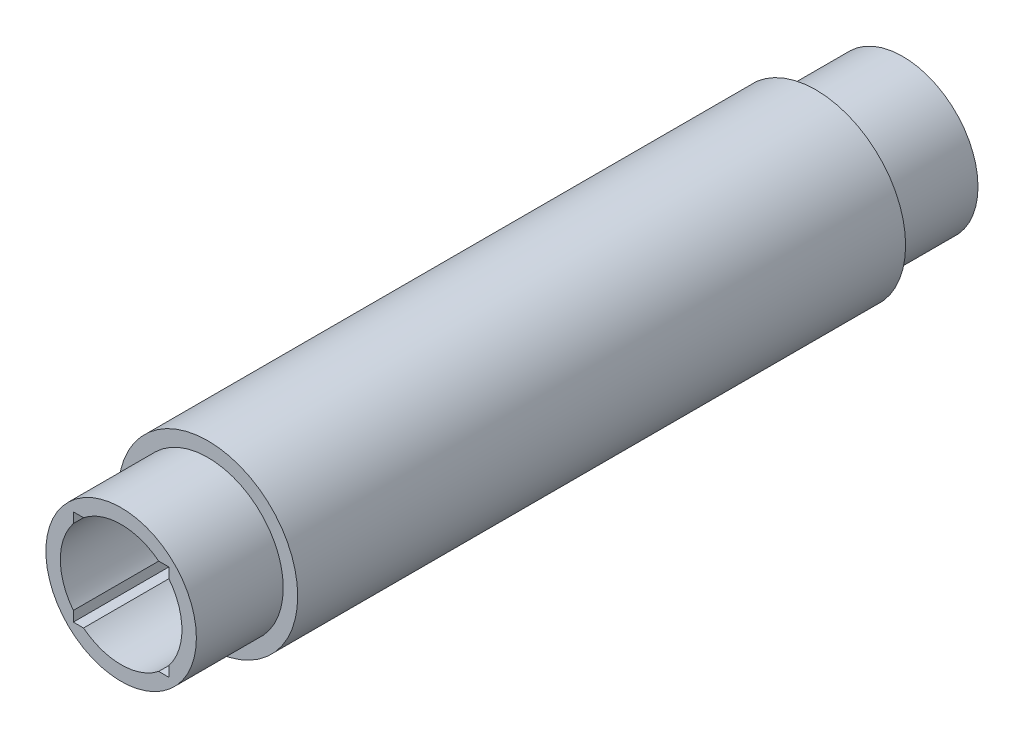
ISO-10303-21;
HEADER;
FILE_DESCRIPTION(('STEP AP214'),'2;1');
FILE_NAME('part.step','',(''),(''),'','','');
FILE_SCHEMA(('AUTOMOTIVE_DESIGN { 1 0 10303 214 1 1 1 1 }'));
ENDSEC;
DATA;
#1=APPLICATION_CONTEXT('core data for automotive mechanical design processes');
#2=APPLICATION_PROTOCOL_DEFINITION('international standard','automotive_design',2000,#1);
#3=PRODUCT_CONTEXT('',#1,'mechanical');
#4=PRODUCT('Part','Part','',(#3));
#5=PRODUCT_RELATED_PRODUCT_CATEGORY('part','',(#4));
#6=PRODUCT_DEFINITION_FORMATION('','',#4);
#7=PRODUCT_DEFINITION_CONTEXT('part definition',#1,'design');
#8=PRODUCT_DEFINITION('design','',#6,#7);
#9=PRODUCT_DEFINITION_SHAPE('','',#8);
#10=(LENGTH_UNIT() NAMED_UNIT(*) SI_UNIT(.MILLI.,.METRE.));
#11=(NAMED_UNIT(*) PLANE_ANGLE_UNIT() SI_UNIT($,.RADIAN.));
#12=(NAMED_UNIT(*) SI_UNIT($,.STERADIAN.) SOLID_ANGLE_UNIT());
#13=UNCERTAINTY_MEASURE_WITH_UNIT(LENGTH_MEASURE(1.E-05),#10,'distance_accuracy_value','');
#14=(GEOMETRIC_REPRESENTATION_CONTEXT(3) GLOBAL_UNCERTAINTY_ASSIGNED_CONTEXT((#13)) GLOBAL_UNIT_ASSIGNED_CONTEXT((#10,
#11,#12)) REPRESENTATION_CONTEXT('',''));
#15=CARTESIAN_POINT('',(0.,0.,0.));
#16=DIRECTION('',(0.,0.,1.));
#17=DIRECTION('',(1.,0.,0.));
#18=AXIS2_PLACEMENT_3D('',#15,#16,#17);
#19=CARTESIAN_POINT('',(0.,0.,27.));
#20=DIRECTION('',(0.,0.,-1.));
#21=DIRECTION('',(-1.,0.,0.));
#22=AXIS2_PLACEMENT_3D('',#19,#20,#21);
#23=CYLINDRICAL_SURFACE('',#22,4.2);
#24=DIRECTION('',(0.,0.,-1.));
#25=VECTOR('',#24,1.);
#26=CARTESIAN_POINT('',(-2.59807621135332,3.3,27.));
#27=LINE('',#26,#25);
#28=CARTESIAN_POINT('',(-2.59807621135332,3.3,12.));
#29=VERTEX_POINT('',#28);
#30=CARTESIAN_POINT('',(-2.59807621135332,3.3,27.));
#31=VERTEX_POINT('',#30);
#32=EDGE_CURVE('E346',#29,#31,#27,.F.);
#33=ORIENTED_EDGE('',*,*,#32,.F.);
#34=CARTESIAN_POINT('',(0.,0.,12.));
#35=DIRECTION('',(0.,0.,-1.));
#36=DIRECTION('',(-1.,0.,0.));
#37=AXIS2_PLACEMENT_3D('',#34,#35,#36);
#38=CIRCLE('',#37,4.2);
#39=CARTESIAN_POINT('',(-3.3,2.59807621135332,12.));
#40=VERTEX_POINT('',#39);
#41=EDGE_CURVE('E324',#40,#29,#38,.T.);
#42=ORIENTED_EDGE('',*,*,#41,.F.);
#43=DIRECTION('',(0.,0.,-1.));
#44=VECTOR('',#43,1.);
#45=CARTESIAN_POINT('',(-3.3,2.59807621135332,27.));
#46=LINE('',#45,#44);
#47=CARTESIAN_POINT('',(-3.3,2.59807621135332,27.));
#48=VERTEX_POINT('',#47);
#49=EDGE_CURVE('E343',#40,#48,#46,.F.);
#50=ORIENTED_EDGE('',*,*,#49,.T.);
#51=CARTESIAN_POINT('',(0.,0.,27.));
#52=DIRECTION('',(0.,0.,1.));
#53=DIRECTION('',(1.,0.,0.));
#54=AXIS2_PLACEMENT_3D('',#51,#52,#53);
#55=CIRCLE('',#54,4.2);
#56=CARTESIAN_POINT('',(-3.3,-2.59807621135332,27.));
#57=VERTEX_POINT('',#56);
#58=EDGE_CURVE('E710',#48,#57,#55,.T.);
#59=ORIENTED_EDGE('',*,*,#58,.T.);
#60=DIRECTION('',(0.,0.,-1.));
#61=VECTOR('',#60,1.);
#62=CARTESIAN_POINT('',(-3.3,-2.59807621135332,27.));
#63=LINE('',#62,#61);
#64=CARTESIAN_POINT('',(-3.3,-2.59807621135332,12.));
#65=VERTEX_POINT('',#64);
#66=EDGE_CURVE('E323',#57,#65,#63,.T.);
#67=ORIENTED_EDGE('',*,*,#66,.T.);
#68=CARTESIAN_POINT('',(-2.59807621135332,-3.3,12.));
#69=VERTEX_POINT('',#68);
#70=EDGE_CURVE('E321',#69,#65,#38,.T.);
#71=ORIENTED_EDGE('',*,*,#70,.F.);
#72=DIRECTION('',(0.,0.,-1.));
#73=VECTOR('',#72,1.);
#74=CARTESIAN_POINT('',(-2.59807621135332,-3.3,27.));
#75=LINE('',#74,#73);
#76=CARTESIAN_POINT('',(-2.59807621135332,-3.3,27.));
#77=VERTEX_POINT('',#76);
#78=EDGE_CURVE('E328',#69,#77,#75,.F.);
#79=ORIENTED_EDGE('',*,*,#78,.T.);
#80=CARTESIAN_POINT('',(2.59807621135332,-3.3,27.));
#81=VERTEX_POINT('',#80);
#82=EDGE_CURVE('E306',#77,#81,#55,.T.);
#83=ORIENTED_EDGE('',*,*,#82,.T.);
#84=DIRECTION('',(0.,0.,-1.));
#85=VECTOR('',#84,1.);
#86=CARTESIAN_POINT('',(2.59807621135332,-3.3,27.));
#87=LINE('',#86,#85);
#88=CARTESIAN_POINT('',(2.59807621135332,-3.3,12.));
#89=VERTEX_POINT('',#88);
#90=EDGE_CURVE('E331',#81,#89,#87,.T.);
#91=ORIENTED_EDGE('',*,*,#90,.T.);
#92=CARTESIAN_POINT('',(3.3,-2.59807621135332,12.));
#93=VERTEX_POINT('',#92);
#94=EDGE_CURVE('E325',#93,#89,#38,.T.);
#95=ORIENTED_EDGE('',*,*,#94,.F.);
#96=DIRECTION('',(0.,0.,-1.));
#97=VECTOR('',#96,1.);
#98=CARTESIAN_POINT('',(3.3,-2.59807621135332,27.));
#99=LINE('',#98,#97);
#100=CARTESIAN_POINT('',(3.3,-2.59807621135332,27.));
#101=VERTEX_POINT('',#100);
#102=EDGE_CURVE('E334',#101,#93,#99,.T.);
#103=ORIENTED_EDGE('',*,*,#102,.F.);
#104=CARTESIAN_POINT('',(3.3,2.59807621135332,27.));
#105=VERTEX_POINT('',#104);
#106=EDGE_CURVE('E303',#101,#105,#55,.T.);
#107=ORIENTED_EDGE('',*,*,#106,.T.);
#108=DIRECTION('',(0.,0.,-1.));
#109=VECTOR('',#108,1.);
#110=CARTESIAN_POINT('',(3.3,2.59807621135332,27.));
#111=LINE('',#110,#109);
#112=CARTESIAN_POINT('',(3.3,2.59807621135332,12.));
#113=VERTEX_POINT('',#112);
#114=EDGE_CURVE('E338',#113,#105,#111,.F.);
#115=ORIENTED_EDGE('',*,*,#114,.F.);
#116=CARTESIAN_POINT('',(2.59807621135332,3.3,12.));
#117=VERTEX_POINT('',#116);
#118=EDGE_CURVE('E337',#117,#113,#38,.T.);
#119=ORIENTED_EDGE('',*,*,#118,.F.);
#120=DIRECTION('',(0.,0.,-1.));
#121=VECTOR('',#120,1.);
#122=CARTESIAN_POINT('',(2.59807621135332,3.3,27.));
#123=LINE('',#122,#121);
#124=CARTESIAN_POINT('',(2.59807621135332,3.3,27.));
#125=VERTEX_POINT('',#124);
#126=EDGE_CURVE('E340',#125,#117,#123,.T.);
#127=ORIENTED_EDGE('',*,*,#126,.F.);
#128=EDGE_CURVE('E308',#125,#31,#55,.T.);
#129=ORIENTED_EDGE('',*,*,#128,.T.);
#130=EDGE_LOOP('',(#33,#42,#50,#59,#67,#71,#79,#83,#91,#95,#103,#107,#115,#119,#127,#129));
#131=FACE_BOUND('',#130,.T.);
#132=CARTESIAN_POINT('',(0.,0.,-12.));
#133=DIRECTION('',(0.,0.,1.));
#134=DIRECTION('',(1.,0.,0.));
#135=AXIS2_PLACEMENT_3D('',#132,#133,#134);
#136=CIRCLE('',#135,4.2);
#137=CARTESIAN_POINT('',(3.3,2.59807621135332,-12.));
#138=VERTEX_POINT('',#137);
#139=CARTESIAN_POINT('',(2.59807621135332,3.3,-12.));
#140=VERTEX_POINT('',#139);
#141=EDGE_CURVE('E12',#138,#140,#136,.T.);
#142=ORIENTED_EDGE('',*,*,#141,.F.);
#143=DIRECTION('',(0.,0.,-1.));
#144=VECTOR('',#143,1.);
#145=CARTESIAN_POINT('',(3.3,2.59807621135332,27.));
#146=LINE('',#145,#144);
#147=CARTESIAN_POINT('',(3.3,2.59807621135332,-27.));
#148=VERTEX_POINT('',#147);
#149=EDGE_CURVE('E213',#138,#148,#146,.T.);
#150=ORIENTED_EDGE('',*,*,#149,.T.);
#151=CARTESIAN_POINT('',(0.,0.,-27.));
#152=DIRECTION('',(0.,0.,1.));
#153=DIRECTION('',(1.,0.,0.));
#154=AXIS2_PLACEMENT_3D('',#151,#152,#153);
#155=CIRCLE('',#154,4.2);
#156=CARTESIAN_POINT('',(3.3,-2.59807621135332,-27.));
#157=VERTEX_POINT('',#156);
#158=EDGE_CURVE('E300',#157,#148,#155,.T.);
#159=ORIENTED_EDGE('',*,*,#158,.F.);
#160=DIRECTION('',(0.,0.,-1.));
#161=VECTOR('',#160,1.);
#162=CARTESIAN_POINT('',(3.3,-2.59807621135332,27.));
#163=LINE('',#162,#161);
#164=CARTESIAN_POINT('',(3.3,-2.59807621135332,-12.));
#165=VERTEX_POINT('',#164);
#166=EDGE_CURVE('E251',#157,#165,#163,.F.);
#167=ORIENTED_EDGE('',*,*,#166,.T.);
#168=CARTESIAN_POINT('',(2.59807621135332,-3.3,-12.));
#169=VERTEX_POINT('',#168);
#170=EDGE_CURVE('E46',#169,#165,#136,.T.);
#171=ORIENTED_EDGE('',*,*,#170,.F.);
#172=DIRECTION('',(0.,0.,-1.));
#173=VECTOR('',#172,1.);
#174=CARTESIAN_POINT('',(2.59807621135332,-3.3,27.));
#175=LINE('',#174,#173);
#176=CARTESIAN_POINT('',(2.59807621135332,-3.3,-27.));
#177=VERTEX_POINT('',#176);
#178=EDGE_CURVE('E232',#169,#177,#175,.T.);
#179=ORIENTED_EDGE('',*,*,#178,.T.);
#180=CARTESIAN_POINT('',(-2.59807621135332,-3.3,-27.));
#181=VERTEX_POINT('',#180);
#182=EDGE_CURVE('E311',#181,#177,#155,.T.);
#183=ORIENTED_EDGE('',*,*,#182,.F.);
#184=DIRECTION('',(0.,0.,-1.));
#185=VECTOR('',#184,1.);
#186=CARTESIAN_POINT('',(-2.59807621135332,-3.3,27.));
#187=LINE('',#186,#185);
#188=CARTESIAN_POINT('',(-2.59807621135332,-3.3,-12.));
#189=VERTEX_POINT('',#188);
#190=EDGE_CURVE('E66',#181,#189,#187,.F.);
#191=ORIENTED_EDGE('',*,*,#190,.T.);
#192=CARTESIAN_POINT('',(-3.3,-2.59807621135332,-12.));
#193=VERTEX_POINT('',#192);
#194=EDGE_CURVE('E499',#193,#189,#136,.T.);
#195=ORIENTED_EDGE('',*,*,#194,.F.);
#196=DIRECTION('',(0.,0.,-1.));
#197=VECTOR('',#196,1.);
#198=CARTESIAN_POINT('',(-3.3,-2.59807621135332,27.));
#199=LINE('',#198,#197);
#200=CARTESIAN_POINT('',(-3.3,-2.59807621135332,-27.));
#201=VERTEX_POINT('',#200);
#202=EDGE_CURVE('E243',#193,#201,#199,.T.);
#203=ORIENTED_EDGE('',*,*,#202,.T.);
#204=CARTESIAN_POINT('',(-3.3,2.59807621135332,-27.));
#205=VERTEX_POINT('',#204);
#206=EDGE_CURVE('E367',#205,#201,#155,.T.);
#207=ORIENTED_EDGE('',*,*,#206,.F.);
#208=DIRECTION('',(0.,0.,-1.));
#209=VECTOR('',#208,1.);
#210=CARTESIAN_POINT('',(-3.3,2.59807621135332,27.));
#211=LINE('',#210,#209);
#212=CARTESIAN_POINT('',(-3.3,2.59807621135332,-12.));
#213=VERTEX_POINT('',#212);
#214=EDGE_CURVE('E240',#205,#213,#211,.F.);
#215=ORIENTED_EDGE('',*,*,#214,.T.);
#216=CARTESIAN_POINT('',(-2.59807621135332,3.3,-12.));
#217=VERTEX_POINT('',#216);
#218=EDGE_CURVE('E51',#217,#213,#136,.T.);
#219=ORIENTED_EDGE('',*,*,#218,.F.);
#220=DIRECTION('',(0.,0.,-1.));
#221=VECTOR('',#220,1.);
#222=CARTESIAN_POINT('',(-2.59807621135332,3.3,27.));
#223=LINE('',#222,#221);
#224=CARTESIAN_POINT('',(-2.59807621135332,3.3,-27.));
#225=VERTEX_POINT('',#224);
#226=EDGE_CURVE('E248',#217,#225,#223,.T.);
#227=ORIENTED_EDGE('',*,*,#226,.T.);
#228=CARTESIAN_POINT('',(2.59807621135332,3.3,-27.));
#229=VERTEX_POINT('',#228);
#230=EDGE_CURVE('E307',#229,#225,#155,.T.);
#231=ORIENTED_EDGE('',*,*,#230,.F.);
#232=DIRECTION('',(0.,0.,-1.));
#233=VECTOR('',#232,1.);
#234=CARTESIAN_POINT('',(2.59807621135332,3.3,27.));
#235=LINE('',#234,#233);
#236=EDGE_CURVE('E246',#229,#140,#235,.F.);
#237=ORIENTED_EDGE('',*,*,#236,.T.);
#238=EDGE_LOOP('',(#142,#150,#159,#167,#171,#179,#183,#191,#195,#203,#207,#215,#219,#227,#231,#237));
#239=FACE_BOUND('',#238,.T.);
#240=ADVANCED_FACE('F42',(#131,#239),#23,.F.);
#241=CARTESIAN_POINT('',(0.,0.,-27.));
#242=DIRECTION('',(0.,0.,1.));
#243=DIRECTION('',(1.,0.,0.));
#244=AXIS2_PLACEMENT_3D('',#241,#242,#243);
#245=PLANE('',#244);
#246=CARTESIAN_POINT('',(0.,0.,-27.));
#247=DIRECTION('',(0.,0.,1.));
#248=DIRECTION('',(1.,0.,0.));
#249=AXIS2_PLACEMENT_3D('',#246,#247,#248);
#250=CIRCLE('',#249,5.2);
#251=CARTESIAN_POINT('',(5.2,0.,-27.));
#252=VERTEX_POINT('',#251);
#253=EDGE_CURVE('E316',#252,#252,#250,.T.);
#254=ORIENTED_EDGE('',*,*,#253,.F.);
#255=EDGE_LOOP('',(#254));
#256=FACE_BOUND('',#255,.T.);
#257=DIRECTION('',(0.,-1.,0.));
#258=VECTOR('',#257,1.);
#259=CARTESIAN_POINT('',(3.3,0.,-27.));
#260=LINE('',#259,#258);
#261=CARTESIAN_POINT('',(3.3,3.3,-27.));
#262=VERTEX_POINT('',#261);
#263=EDGE_CURVE('E353',#262,#148,#260,.T.);
#264=ORIENTED_EDGE('',*,*,#263,.F.);
#265=DIRECTION('',(-1.,0.,0.));
#266=VECTOR('',#265,1.);
#267=CARTESIAN_POINT('',(0.,3.3,-27.));
#268=LINE('',#267,#266);
#269=EDGE_CURVE('E229',#262,#229,#268,.T.);
#270=ORIENTED_EDGE('',*,*,#269,.T.);
#271=ORIENTED_EDGE('',*,*,#230,.T.);
#272=DIRECTION('',(1.,0.,0.));
#273=VECTOR('',#272,1.);
#274=CARTESIAN_POINT('',(0.,3.3,-27.));
#275=LINE('',#274,#273);
#276=CARTESIAN_POINT('',(-3.3,3.3,-27.));
#277=VERTEX_POINT('',#276);
#278=EDGE_CURVE('E351',#277,#225,#275,.T.);
#279=ORIENTED_EDGE('',*,*,#278,.F.);
#280=DIRECTION('',(0.,-1.,0.));
#281=VECTOR('',#280,1.);
#282=CARTESIAN_POINT('',(-3.3,0.,-27.));
#283=LINE('',#282,#281);
#284=EDGE_CURVE('E393',#277,#205,#283,.T.);
#285=ORIENTED_EDGE('',*,*,#284,.T.);
#286=ORIENTED_EDGE('',*,*,#206,.T.);
#287=DIRECTION('',(0.,1.,0.));
#288=VECTOR('',#287,1.);
#289=CARTESIAN_POINT('',(-3.3,0.,-27.));
#290=LINE('',#289,#288);
#291=CARTESIAN_POINT('',(-3.3,-3.3,-27.));
#292=VERTEX_POINT('',#291);
#293=EDGE_CURVE('E348',#292,#201,#290,.T.);
#294=ORIENTED_EDGE('',*,*,#293,.F.);
#295=DIRECTION('',(1.,0.,0.));
#296=VECTOR('',#295,1.);
#297=CARTESIAN_POINT('',(0.,-3.3,-27.));
#298=LINE('',#297,#296);
#299=EDGE_CURVE('E217',#292,#181,#298,.T.);
#300=ORIENTED_EDGE('',*,*,#299,.T.);
#301=ORIENTED_EDGE('',*,*,#182,.T.);
#302=DIRECTION('',(-1.,0.,0.));
#303=VECTOR('',#302,1.);
#304=CARTESIAN_POINT('',(0.,-3.3,-27.));
#305=LINE('',#304,#303);
#306=CARTESIAN_POINT('',(3.3,-3.3,-27.));
#307=VERTEX_POINT('',#306);
#308=EDGE_CURVE('E349',#307,#177,#305,.T.);
#309=ORIENTED_EDGE('',*,*,#308,.F.);
#310=DIRECTION('',(0.,1.,0.));
#311=VECTOR('',#310,1.);
#312=CARTESIAN_POINT('',(3.3,0.,-27.));
#313=LINE('',#312,#311);
#314=EDGE_CURVE('E58',#307,#157,#313,.T.);
#315=ORIENTED_EDGE('',*,*,#314,.T.);
#316=ORIENTED_EDGE('',*,*,#158,.T.);
#317=EDGE_LOOP('',(#264,#270,#271,#279,#285,#286,#294,#300,#301,#309,#315,#316));
#318=FACE_BOUND('',#317,.T.);
#319=ADVANCED_FACE('F366',(#256,#318),#245,.F.);
#320=CARTESIAN_POINT('',(0.,0.,27.));
#321=DIRECTION('',(0.,0.,1.));
#322=DIRECTION('',(1.,0.,0.));
#323=AXIS2_PLACEMENT_3D('',#320,#321,#322);
#324=PLANE('',#323);
#325=DIRECTION('',(-1.,0.,0.));
#326=VECTOR('',#325,1.);
#327=CARTESIAN_POINT('',(0.,3.3,27.));
#328=LINE('',#327,#326);
#329=CARTESIAN_POINT('',(3.3,3.3,27.));
#330=VERTEX_POINT('',#329);
#331=EDGE_CURVE('E271',#330,#125,#328,.T.);
#332=ORIENTED_EDGE('',*,*,#331,.F.);
#333=DIRECTION('',(0.,1.,0.));
#334=VECTOR('',#333,1.);
#335=CARTESIAN_POINT('',(3.3,0.,27.));
#336=LINE('',#335,#334);
#337=EDGE_CURVE('E281',#105,#330,#336,.T.);
#338=ORIENTED_EDGE('',*,*,#337,.F.);
#339=ORIENTED_EDGE('',*,*,#106,.F.);
#340=CARTESIAN_POINT('',(3.3,-3.3,27.));
#341=VERTEX_POINT('',#340);
#342=EDGE_CURVE('E282',#341,#101,#336,.T.);
#343=ORIENTED_EDGE('',*,*,#342,.F.);
#344=DIRECTION('',(-1.,0.,0.));
#345=VECTOR('',#344,1.);
#346=CARTESIAN_POINT('',(0.,-3.3,27.));
#347=LINE('',#346,#345);
#348=EDGE_CURVE('E278',#341,#81,#347,.T.);
#349=ORIENTED_EDGE('',*,*,#348,.T.);
#350=ORIENTED_EDGE('',*,*,#82,.F.);
#351=CARTESIAN_POINT('',(-3.3,-3.3,27.));
#352=VERTEX_POINT('',#351);
#353=EDGE_CURVE('E277',#77,#352,#347,.T.);
#354=ORIENTED_EDGE('',*,*,#353,.T.);
#355=DIRECTION('',(0.,1.,0.));
#356=VECTOR('',#355,1.);
#357=CARTESIAN_POINT('',(-3.3,0.,27.));
#358=LINE('',#357,#356);
#359=EDGE_CURVE('E274',#352,#57,#358,.T.);
#360=ORIENTED_EDGE('',*,*,#359,.T.);
#361=ORIENTED_EDGE('',*,*,#58,.F.);
#362=CARTESIAN_POINT('',(-3.3,3.3,27.));
#363=VERTEX_POINT('',#362);
#364=EDGE_CURVE('E273',#48,#363,#358,.T.);
#365=ORIENTED_EDGE('',*,*,#364,.T.);
#366=EDGE_CURVE('E255',#31,#363,#328,.T.);
#367=ORIENTED_EDGE('',*,*,#366,.F.);
#368=ORIENTED_EDGE('',*,*,#128,.F.);
#369=EDGE_LOOP('',(#332,#338,#339,#343,#349,#350,#354,#360,#361,#365,#367,#368));
#370=FACE_BOUND('',#369,.T.);
#371=CARTESIAN_POINT('',(0.,0.,27.));
#372=DIRECTION('',(0.,0.,1.));
#373=DIRECTION('',(1.,0.,0.));
#374=AXIS2_PLACEMENT_3D('',#371,#372,#373);
#375=CIRCLE('',#374,5.2);
#376=CARTESIAN_POINT('',(5.2,0.,27.));
#377=VERTEX_POINT('',#376);
#378=EDGE_CURVE('E312',#377,#377,#375,.T.);
#379=ORIENTED_EDGE('',*,*,#378,.T.);
#380=EDGE_LOOP('',(#379));
#381=FACE_BOUND('',#380,.T.);
#382=ADVANCED_FACE('F425',(#370,#381),#324,.T.);
#383=CARTESIAN_POINT('',(0.,0.,27.));
#384=DIRECTION('',(0.,0.,-1.));
#385=DIRECTION('',(-1.,0.,0.));
#386=AXIS2_PLACEMENT_3D('',#383,#384,#385);
#387=CYLINDRICAL_SURFACE('',#386,5.2);
#388=ORIENTED_EDGE('',*,*,#253,.T.);
#389=EDGE_LOOP('',(#388));
#390=FACE_BOUND('',#389,.T.);
#391=CARTESIAN_POINT('',(0.,0.,-21.));
#392=DIRECTION('',(0.,0.,1.));
#393=DIRECTION('',(1.,0.,0.));
#394=AXIS2_PLACEMENT_3D('',#391,#392,#393);
#395=CIRCLE('',#394,5.2);
#396=CARTESIAN_POINT('',(5.2,0.,-21.));
#397=VERTEX_POINT('',#396);
#398=EDGE_CURVE('E315',#397,#397,#395,.T.);
#399=ORIENTED_EDGE('',*,*,#398,.F.);
#400=EDGE_LOOP('',(#399));
#401=FACE_BOUND('',#400,.T.);
#402=ADVANCED_FACE('F433',(#390,#401),#387,.T.);
#403=CARTESIAN_POINT('',(0.,0.,21.));
#404=DIRECTION('',(0.,0.,1.));
#405=DIRECTION('',(1.,0.,0.));
#406=AXIS2_PLACEMENT_3D('',#403,#404,#405);
#407=CIRCLE('',#406,5.2);
#408=CARTESIAN_POINT('',(5.2,0.,21.));
#409=VERTEX_POINT('',#408);
#410=EDGE_CURVE('E294',#409,#409,#407,.T.);
#411=ORIENTED_EDGE('',*,*,#410,.T.);
#412=EDGE_LOOP('',(#411));
#413=FACE_BOUND('',#412,.T.);
#414=ORIENTED_EDGE('',*,*,#378,.F.);
#415=EDGE_LOOP('',(#414));
#416=FACE_BOUND('',#415,.T.);
#417=ADVANCED_FACE('F44',(#413,#416),#387,.T.);
#418=CARTESIAN_POINT('',(0.,0.,21.));
#419=DIRECTION('',(0.,0.,-1.));
#420=DIRECTION('',(-1.,0.,0.));
#421=AXIS2_PLACEMENT_3D('',#418,#419,#420);
#422=CYLINDRICAL_SURFACE('',#421,6.2);
#423=CARTESIAN_POINT('',(0.,0.,21.));
#424=DIRECTION('',(0.,0.,1.));
#425=DIRECTION('',(1.,0.,0.));
#426=AXIS2_PLACEMENT_3D('',#423,#424,#425);
#427=CIRCLE('',#426,6.2);
#428=CARTESIAN_POINT('',(-6.2,0.,21.));
#429=VERTEX_POINT('',#428);
#430=EDGE_CURVE('E297',#429,#429,#427,.T.);
#431=CARTESIAN_POINT('',(0.,0.,-21.));
#432=DIRECTION('',(0.,0.,1.));
#433=DIRECTION('',(1.,0.,0.));
#434=AXIS2_PLACEMENT_3D('',#431,#432,#433);
#435=CIRCLE('',#434,6.2);
#436=CARTESIAN_POINT('',(-6.2,0.,-21.));
#437=VERTEX_POINT('',#436);
#438=EDGE_CURVE('E287',#437,#437,#435,.T.);
#439=CARTESIAN_POINT('',(-6.2,0.,21.));
#440=CARTESIAN_POINT('',(-6.2,0.,20.5625));
#441=CARTESIAN_POINT('',(-6.2,0.,20.125));
#442=CARTESIAN_POINT('',(-6.2,0.,19.25));
#443=CARTESIAN_POINT('',(-6.2,0.,18.8125));
#444=CARTESIAN_POINT('',(-6.2,0.,17.9375));
#445=CARTESIAN_POINT('',(-6.2,0.,17.5));
#446=CARTESIAN_POINT('',(-6.2,0.,16.625));
#447=CARTESIAN_POINT('',(-6.2,0.,16.1875));
#448=CARTESIAN_POINT('',(-6.2,0.,15.3125));
#449=CARTESIAN_POINT('',(-6.2,0.,14.875));
#450=CARTESIAN_POINT('',(-6.2,0.,14.));
#451=CARTESIAN_POINT('',(-6.2,0.,13.5625));
#452=CARTESIAN_POINT('',(-6.2,0.,12.6875));
#453=CARTESIAN_POINT('',(-6.2,0.,12.25));
#454=CARTESIAN_POINT('',(-6.2,0.,11.375));
#455=CARTESIAN_POINT('',(-6.2,0.,10.9375));
#456=CARTESIAN_POINT('',(-6.2,0.,10.0625));
#457=CARTESIAN_POINT('',(-6.2,0.,9.625));
#458=CARTESIAN_POINT('',(-6.2,0.,8.75));
#459=CARTESIAN_POINT('',(-6.2,0.,8.3125));
#460=CARTESIAN_POINT('',(-6.2,0.,7.4375));
#461=CARTESIAN_POINT('',(-6.2,0.,7.));
#462=CARTESIAN_POINT('',(-6.2,0.,6.125));
#463=CARTESIAN_POINT('',(-6.2,0.,5.6875));
#464=CARTESIAN_POINT('',(-6.2,0.,4.8125));
#465=CARTESIAN_POINT('',(-6.2,0.,4.375));
#466=CARTESIAN_POINT('',(-6.2,0.,3.5));
#467=CARTESIAN_POINT('',(-6.2,0.,3.0625));
#468=CARTESIAN_POINT('',(-6.2,0.,2.1875));
#469=CARTESIAN_POINT('',(-6.2,0.,1.75));
#470=CARTESIAN_POINT('',(-6.2,0.,0.874999999999997));
#471=CARTESIAN_POINT('',(-6.2,0.,0.437499999999997));
#472=CARTESIAN_POINT('',(-6.2,0.,-0.437500000000004));
#473=CARTESIAN_POINT('',(-6.2,0.,-0.875000000000004));
#474=CARTESIAN_POINT('',(-6.2,0.,-1.75000000000001));
#475=CARTESIAN_POINT('',(-6.2,0.,-2.18750000000001));
#476=CARTESIAN_POINT('',(-6.2,0.,-3.0625));
#477=CARTESIAN_POINT('',(-6.2,0.,-3.5));
#478=CARTESIAN_POINT('',(-6.2,0.,-4.375));
#479=CARTESIAN_POINT('',(-6.2,0.,-4.8125));
#480=CARTESIAN_POINT('',(-6.2,0.,-5.68750000000001));
#481=CARTESIAN_POINT('',(-6.2,0.,-6.12500000000001));
#482=CARTESIAN_POINT('',(-6.2,0.,-7.00000000000001));
#483=CARTESIAN_POINT('',(-6.2,0.,-7.4375));
#484=CARTESIAN_POINT('',(-6.2,0.,-8.3125));
#485=CARTESIAN_POINT('',(-6.2,0.,-8.75));
#486=CARTESIAN_POINT('',(-6.2,0.,-9.625));
#487=CARTESIAN_POINT('',(-6.2,0.,-10.0625));
#488=CARTESIAN_POINT('',(-6.2,0.,-10.9375));
#489=CARTESIAN_POINT('',(-6.2,0.,-11.375));
#490=CARTESIAN_POINT('',(-6.2,0.,-12.25));
#491=CARTESIAN_POINT('',(-6.2,0.,-12.6875));
#492=CARTESIAN_POINT('',(-6.2,0.,-13.5625));
#493=CARTESIAN_POINT('',(-6.2,0.,-14.));
#494=CARTESIAN_POINT('',(-6.2,0.,-14.875));
#495=CARTESIAN_POINT('',(-6.2,0.,-15.3125));
#496=CARTESIAN_POINT('',(-6.2,0.,-16.1875));
#497=CARTESIAN_POINT('',(-6.2,0.,-16.625));
#498=CARTESIAN_POINT('',(-6.2,0.,-17.5));
#499=CARTESIAN_POINT('',(-6.2,0.,-17.9375));
#500=CARTESIAN_POINT('',(-6.2,0.,-18.8125));
#501=CARTESIAN_POINT('',(-6.2,0.,-19.25));
#502=CARTESIAN_POINT('',(-6.2,0.,-20.125));
#503=CARTESIAN_POINT('',(-6.2,0.,-20.5625));
#504=CARTESIAN_POINT('',(-6.2,0.,-21.));
#505=B_SPLINE_CURVE_WITH_KNOTS('',3,(#439,#440,#441,#442,#443,#444,#445,#446,#447,#448,#449,
#450,#451,#452,#453,#454,#455,#456,#457,#458,#459,#460,#461,#462,#463,#464,#465,#466,#467,#468,
#469,#470,#471,#472,#473,#474,#475,#476,#477,#478,#479,#480,#481,#482,#483,#484,#485,#486,#487,
#488,#489,#490,#491,#492,#493,#494,#495,#496,#497,#498,#499,#500,#501,#502,#503,#504),
.UNSPECIFIED.,.F.,.F.,(4,2,2,2,2,2,2,2,2,2,2,2,2,2,2,2,2,2,2,2,2,2,2,2,2,2,2,2,2,2,2,2,4),(0.,
1.3125,2.625,3.9375,5.25,6.5625,7.875,9.1875,10.5,11.8125,13.125,14.4375,15.75,17.0625,18.375,
19.6875,21.,22.3125,23.625,24.9375,26.25,27.5625,28.875,30.1875,31.5,32.8125,34.125,35.4375,
36.75,38.0625,39.375,40.6875,42.),.UNSPECIFIED.);
#506=EDGE_CURVE('BSEAM430',#429,#437,#505,.T.);
#507=ORIENTED_EDGE('',*,*,#430,.F.);
#508=ORIENTED_EDGE('',*,*,#438,.T.);
#509=ORIENTED_EDGE('',*,*,#506,.T.);
#510=ORIENTED_EDGE('',*,*,#506,.F.);
#511=EDGE_LOOP('',(#507,#509,#508,#510));
#512=FACE_BOUND('',#511,.T.);
#513=ADVANCED_FACE('F430',(#512),#422,.T.);
#514=CARTESIAN_POINT('',(0.,0.,21.));
#515=DIRECTION('',(0.,0.,1.));
#516=DIRECTION('',(1.,0.,0.));
#517=AXIS2_PLACEMENT_3D('',#514,#515,#516);
#518=PLANE('',#517);
#519=ORIENTED_EDGE('',*,*,#410,.F.);
#520=EDGE_LOOP('',(#519));
#521=FACE_BOUND('',#520,.T.);
#522=ORIENTED_EDGE('',*,*,#430,.T.);
#523=EDGE_LOOP('',(#522));
#524=FACE_BOUND('',#523,.T.);
#525=ADVANCED_FACE('F450',(#521,#524),#518,.T.);
#526=CARTESIAN_POINT('',(0.,0.,-21.));
#527=DIRECTION('',(0.,0.,1.));
#528=DIRECTION('',(1.,0.,0.));
#529=AXIS2_PLACEMENT_3D('',#526,#527,#528);
#530=PLANE('',#529);
#531=ORIENTED_EDGE('',*,*,#398,.T.);
#532=EDGE_LOOP('',(#531));
#533=FACE_BOUND('',#532,.T.);
#534=ORIENTED_EDGE('',*,*,#438,.F.);
#535=EDGE_LOOP('',(#534));
#536=FACE_BOUND('',#535,.T.);
#537=ADVANCED_FACE('F456',(#533,#536),#530,.F.);
#538=CARTESIAN_POINT('',(0.,0.,12.));
#539=DIRECTION('',(0.,0.,-1.));
#540=DIRECTION('',(-1.,0.,0.));
#541=AXIS2_PLACEMENT_3D('',#538,#539,#540);
#542=PLANE('',#541);
#543=ORIENTED_EDGE('',*,*,#70,.T.);
#544=DIRECTION('',(0.,1.,0.));
#545=VECTOR('',#544,1.);
#546=CARTESIAN_POINT('',(-3.3,0.,12.));
#547=LINE('',#546,#545);
#548=CARTESIAN_POINT('',(-3.3,-3.3,12.));
#549=VERTEX_POINT('',#548);
#550=EDGE_CURVE('E260',#549,#65,#547,.T.);
#551=ORIENTED_EDGE('',*,*,#550,.F.);
#552=DIRECTION('',(-1.,0.,0.));
#553=VECTOR('',#552,1.);
#554=CARTESIAN_POINT('',(0.,-3.3,12.));
#555=LINE('',#554,#553);
#556=EDGE_CURVE('E263',#69,#549,#555,.T.);
#557=ORIENTED_EDGE('',*,*,#556,.F.);
#558=EDGE_LOOP('',(#543,#551,#557));
#559=FACE_BOUND('',#558,.T.);
#560=ADVANCED_FACE('F463',(#559),#542,.F.);
#561=CARTESIAN_POINT('',(-3.3,0.,12.));
#562=DIRECTION('',(1.,0.,0.));
#563=DIRECTION('',(0.,1.,0.));
#564=AXIS2_PLACEMENT_3D('',#561,#562,#563);
#565=PLANE('',#564);
#566=ORIENTED_EDGE('',*,*,#359,.F.);
#567=DIRECTION('',(0.,0.,1.));
#568=VECTOR('',#567,1.);
#569=CARTESIAN_POINT('',(-3.3,-3.3,12.));
#570=LINE('',#569,#568);
#571=EDGE_CURVE('E290',#549,#352,#570,.T.);
#572=ORIENTED_EDGE('',*,*,#571,.F.);
#573=ORIENTED_EDGE('',*,*,#550,.T.);
#574=ORIENTED_EDGE('',*,*,#66,.F.);
#575=EDGE_LOOP('',(#566,#572,#573,#574));
#576=FACE_BOUND('',#575,.T.);
#577=ADVANCED_FACE('F415',(#576),#565,.T.);
#578=CARTESIAN_POINT('',(0.,-3.3,12.));
#579=DIRECTION('',(0.,1.,0.));
#580=DIRECTION('',(0.,0.,1.));
#581=AXIS2_PLACEMENT_3D('',#578,#579,#580);
#582=PLANE('',#581);
#583=ORIENTED_EDGE('',*,*,#556,.T.);
#584=ORIENTED_EDGE('',*,*,#571,.T.);
#585=ORIENTED_EDGE('',*,*,#353,.F.);
#586=ORIENTED_EDGE('',*,*,#78,.F.);
#587=EDGE_LOOP('',(#583,#584,#585,#586));
#588=FACE_BOUND('',#587,.T.);
#589=ADVANCED_FACE('F477',(#588),#582,.T.);
#590=ORIENTED_EDGE('',*,*,#94,.T.);
#591=CARTESIAN_POINT('',(3.3,-3.3,12.));
#592=VERTEX_POINT('',#591);
#593=EDGE_CURVE('E264',#592,#89,#555,.T.);
#594=ORIENTED_EDGE('',*,*,#593,.F.);
#595=DIRECTION('',(0.,1.,0.));
#596=VECTOR('',#595,1.);
#597=CARTESIAN_POINT('',(3.3,0.,12.));
#598=LINE('',#597,#596);
#599=EDGE_CURVE('E268',#592,#93,#598,.T.);
#600=ORIENTED_EDGE('',*,*,#599,.T.);
#601=EDGE_LOOP('',(#590,#594,#600));
#602=FACE_BOUND('',#601,.T.);
#603=ADVANCED_FACE('F471',(#602),#542,.F.);
#604=ORIENTED_EDGE('',*,*,#348,.F.);
#605=DIRECTION('',(0.,0.,1.));
#606=VECTOR('',#605,1.);
#607=CARTESIAN_POINT('',(3.3,-3.3,12.));
#608=LINE('',#607,#606);
#609=EDGE_CURVE('E288',#592,#341,#608,.T.);
#610=ORIENTED_EDGE('',*,*,#609,.F.);
#611=ORIENTED_EDGE('',*,*,#593,.T.);
#612=ORIENTED_EDGE('',*,*,#90,.F.);
#613=EDGE_LOOP('',(#604,#610,#611,#612));
#614=FACE_BOUND('',#613,.T.);
#615=ADVANCED_FACE('F481',(#614),#582,.T.);
#616=CARTESIAN_POINT('',(3.3,0.,12.));
#617=DIRECTION('',(1.,0.,0.));
#618=DIRECTION('',(0.,1.,0.));
#619=AXIS2_PLACEMENT_3D('',#616,#617,#618);
#620=PLANE('',#619);
#621=ORIENTED_EDGE('',*,*,#102,.T.);
#622=ORIENTED_EDGE('',*,*,#599,.F.);
#623=ORIENTED_EDGE('',*,*,#609,.T.);
#624=ORIENTED_EDGE('',*,*,#342,.T.);
#625=EDGE_LOOP('',(#621,#622,#623,#624));
#626=FACE_BOUND('',#625,.T.);
#627=ADVANCED_FACE('F486',(#626),#620,.F.);
#628=ORIENTED_EDGE('',*,*,#118,.T.);
#629=CARTESIAN_POINT('',(3.3,3.3,12.));
#630=VERTEX_POINT('',#629);
#631=EDGE_CURVE('E267',#113,#630,#598,.T.);
#632=ORIENTED_EDGE('',*,*,#631,.T.);
#633=DIRECTION('',(-1.,0.,0.));
#634=VECTOR('',#633,1.);
#635=CARTESIAN_POINT('',(0.,3.3,12.));
#636=LINE('',#635,#634);
#637=EDGE_CURVE('E256',#630,#117,#636,.T.);
#638=ORIENTED_EDGE('',*,*,#637,.T.);
#639=EDGE_LOOP('',(#628,#632,#638));
#640=FACE_BOUND('',#639,.T.);
#641=ADVANCED_FACE('F484',(#640),#542,.F.);
#642=ORIENTED_EDGE('',*,*,#114,.T.);
#643=ORIENTED_EDGE('',*,*,#337,.T.);
#644=DIRECTION('',(0.,0.,1.));
#645=VECTOR('',#644,1.);
#646=CARTESIAN_POINT('',(3.3,3.3,12.));
#647=LINE('',#646,#645);
#648=EDGE_CURVE('E284',#630,#330,#647,.T.);
#649=ORIENTED_EDGE('',*,*,#648,.F.);
#650=ORIENTED_EDGE('',*,*,#631,.F.);
#651=EDGE_LOOP('',(#642,#643,#649,#650));
#652=FACE_BOUND('',#651,.T.);
#653=ADVANCED_FACE('F482',(#652),#620,.F.);
#654=CARTESIAN_POINT('',(0.,3.3,12.));
#655=DIRECTION('',(0.,1.,0.));
#656=DIRECTION('',(0.,0.,1.));
#657=AXIS2_PLACEMENT_3D('',#654,#655,#656);
#658=PLANE('',#657);
#659=ORIENTED_EDGE('',*,*,#126,.T.);
#660=ORIENTED_EDGE('',*,*,#637,.F.);
#661=ORIENTED_EDGE('',*,*,#648,.T.);
#662=ORIENTED_EDGE('',*,*,#331,.T.);
#663=EDGE_LOOP('',(#659,#660,#661,#662));
#664=FACE_BOUND('',#663,.T.);
#665=ADVANCED_FACE('F475',(#664),#658,.F.);
#666=ORIENTED_EDGE('',*,*,#41,.T.);
#667=CARTESIAN_POINT('',(-3.3,3.3,12.));
#668=VERTEX_POINT('',#667);
#669=EDGE_CURVE('E259',#29,#668,#636,.T.);
#670=ORIENTED_EDGE('',*,*,#669,.T.);
#671=EDGE_CURVE('E258',#40,#668,#547,.T.);
#672=ORIENTED_EDGE('',*,*,#671,.F.);
#673=EDGE_LOOP('',(#666,#670,#672));
#674=FACE_BOUND('',#673,.T.);
#675=ADVANCED_FACE('F470',(#674),#542,.F.);
#676=ORIENTED_EDGE('',*,*,#32,.T.);
#677=ORIENTED_EDGE('',*,*,#366,.T.);
#678=DIRECTION('',(0.,0.,1.));
#679=VECTOR('',#678,1.);
#680=CARTESIAN_POINT('',(-3.3,3.3,12.));
#681=LINE('',#680,#679);
#682=EDGE_CURVE('E270',#668,#363,#681,.T.);
#683=ORIENTED_EDGE('',*,*,#682,.F.);
#684=ORIENTED_EDGE('',*,*,#669,.F.);
#685=EDGE_LOOP('',(#676,#677,#683,#684));
#686=FACE_BOUND('',#685,.T.);
#687=ADVANCED_FACE('F412',(#686),#658,.F.);
#688=ORIENTED_EDGE('',*,*,#671,.T.);
#689=ORIENTED_EDGE('',*,*,#682,.T.);
#690=ORIENTED_EDGE('',*,*,#364,.F.);
#691=ORIENTED_EDGE('',*,*,#49,.F.);
#692=EDGE_LOOP('',(#688,#689,#690,#691));
#693=FACE_BOUND('',#692,.T.);
#694=ADVANCED_FACE('F403',(#693),#565,.T.);
#695=CARTESIAN_POINT('',(0.,-3.3,-12.));
#696=DIRECTION('',(0.,1.,0.));
#697=DIRECTION('',(0.,0.,1.));
#698=AXIS2_PLACEMENT_3D('',#695,#696,#697);
#699=PLANE('',#698);
#700=ORIENTED_EDGE('',*,*,#299,.F.);
#701=DIRECTION('',(0.,0.,-1.));
#702=VECTOR('',#701,1.);
#703=CARTESIAN_POINT('',(-3.3,-3.3,-12.));
#704=LINE('',#703,#702);
#705=CARTESIAN_POINT('',(-3.3,-3.3,-12.));
#706=VERTEX_POINT('',#705);
#707=EDGE_CURVE('E234',#706,#292,#704,.T.);
#708=ORIENTED_EDGE('',*,*,#707,.F.);
#709=DIRECTION('',(1.,0.,0.));
#710=VECTOR('',#709,1.);
#711=CARTESIAN_POINT('',(0.,-3.3,-12.));
#712=LINE('',#711,#710);
#713=EDGE_CURVE('E384',#706,#189,#712,.T.);
#714=ORIENTED_EDGE('',*,*,#713,.T.);
#715=ORIENTED_EDGE('',*,*,#190,.F.);
#716=EDGE_LOOP('',(#700,#708,#714,#715));
#717=FACE_BOUND('',#716,.T.);
#718=ADVANCED_FACE('F401',(#717),#699,.T.);
#719=CARTESIAN_POINT('',(-3.3,0.,-12.));
#720=DIRECTION('',(1.,0.,0.));
#721=DIRECTION('',(0.,1.,0.));
#722=AXIS2_PLACEMENT_3D('',#719,#720,#721);
#723=PLANE('',#722);
#724=DIRECTION('',(0.,-1.,0.));
#725=VECTOR('',#724,1.);
#726=CARTESIAN_POINT('',(-3.3,0.,-12.));
#727=LINE('',#726,#725);
#728=EDGE_CURVE('E224',#193,#706,#727,.T.);
#729=ORIENTED_EDGE('',*,*,#728,.T.);
#730=ORIENTED_EDGE('',*,*,#707,.T.);
#731=ORIENTED_EDGE('',*,*,#293,.T.);
#732=ORIENTED_EDGE('',*,*,#202,.F.);
#733=EDGE_LOOP('',(#729,#730,#731,#732));
#734=FACE_BOUND('',#733,.T.);
#735=ADVANCED_FACE('F398',(#734),#723,.T.);
#736=CARTESIAN_POINT('',(0.,0.,-12.));
#737=DIRECTION('',(0.,0.,1.));
#738=DIRECTION('',(1.,0.,0.));
#739=AXIS2_PLACEMENT_3D('',#736,#737,#738);
#740=PLANE('',#739);
#741=ORIENTED_EDGE('',*,*,#194,.T.);
#742=ORIENTED_EDGE('',*,*,#713,.F.);
#743=ORIENTED_EDGE('',*,*,#728,.F.);
#744=EDGE_LOOP('',(#741,#742,#743));
#745=FACE_BOUND('',#744,.T.);
#746=ADVANCED_FACE('F409',(#745),#740,.F.);
#747=CARTESIAN_POINT('',(3.3,-3.3,-12.));
#748=VERTEX_POINT('',#747);
#749=EDGE_CURVE('E379',#169,#748,#712,.T.);
#750=ORIENTED_EDGE('',*,*,#749,.T.);
#751=DIRECTION('',(0.,0.,-1.));
#752=VECTOR('',#751,1.);
#753=CARTESIAN_POINT('',(3.3,-3.3,-12.));
#754=LINE('',#753,#752);
#755=EDGE_CURVE('E387',#748,#307,#754,.T.);
#756=ORIENTED_EDGE('',*,*,#755,.T.);
#757=ORIENTED_EDGE('',*,*,#308,.T.);
#758=ORIENTED_EDGE('',*,*,#178,.F.);
#759=EDGE_LOOP('',(#750,#756,#757,#758));
#760=FACE_BOUND('',#759,.T.);
#761=ADVANCED_FACE('F378',(#760),#699,.T.);
#762=CARTESIAN_POINT('',(3.3,0.,-12.));
#763=DIRECTION('',(-1.,0.,0.));
#764=DIRECTION('',(0.,-1.,0.));
#765=AXIS2_PLACEMENT_3D('',#762,#763,#764);
#766=PLANE('',#765);
#767=ORIENTED_EDGE('',*,*,#314,.F.);
#768=ORIENTED_EDGE('',*,*,#755,.F.);
#769=DIRECTION('',(0.,1.,0.));
#770=VECTOR('',#769,1.);
#771=CARTESIAN_POINT('',(3.3,0.,-12.));
#772=LINE('',#771,#770);
#773=EDGE_CURVE('E216',#748,#165,#772,.T.);
#774=ORIENTED_EDGE('',*,*,#773,.T.);
#775=ORIENTED_EDGE('',*,*,#166,.F.);
#776=EDGE_LOOP('',(#767,#768,#774,#775));
#777=FACE_BOUND('',#776,.T.);
#778=ADVANCED_FACE('F418',(#777),#766,.T.);
#779=ORIENTED_EDGE('',*,*,#170,.T.);
#780=ORIENTED_EDGE('',*,*,#773,.F.);
#781=ORIENTED_EDGE('',*,*,#749,.F.);
#782=EDGE_LOOP('',(#779,#780,#781));
#783=FACE_BOUND('',#782,.T.);
#784=ADVANCED_FACE('F382',(#783),#740,.F.);
#785=ORIENTED_EDGE('',*,*,#284,.F.);
#786=DIRECTION('',(0.,0.,-1.));
#787=VECTOR('',#786,1.);
#788=CARTESIAN_POINT('',(-3.3,3.3,-12.));
#789=LINE('',#788,#787);
#790=CARTESIAN_POINT('',(-3.3,3.3,-12.));
#791=VERTEX_POINT('',#790);
#792=EDGE_CURVE('E230',#791,#277,#789,.T.);
#793=ORIENTED_EDGE('',*,*,#792,.F.);
#794=EDGE_CURVE('E385',#791,#213,#727,.T.);
#795=ORIENTED_EDGE('',*,*,#794,.T.);
#796=ORIENTED_EDGE('',*,*,#214,.F.);
#797=EDGE_LOOP('',(#785,#793,#795,#796));
#798=FACE_BOUND('',#797,.T.);
#799=ADVANCED_FACE('F411',(#798),#723,.T.);
#800=CARTESIAN_POINT('',(0.,3.3,-12.));
#801=DIRECTION('',(0.,-1.,0.));
#802=DIRECTION('',(0.,0.,-1.));
#803=AXIS2_PLACEMENT_3D('',#800,#801,#802);
#804=PLANE('',#803);
#805=DIRECTION('',(-1.,0.,0.));
#806=VECTOR('',#805,1.);
#807=CARTESIAN_POINT('',(0.,3.3,-12.));
#808=LINE('',#807,#806);
#809=EDGE_CURVE('E225',#217,#791,#808,.T.);
#810=ORIENTED_EDGE('',*,*,#809,.T.);
#811=ORIENTED_EDGE('',*,*,#792,.T.);
#812=ORIENTED_EDGE('',*,*,#278,.T.);
#813=ORIENTED_EDGE('',*,*,#226,.F.);
#814=EDGE_LOOP('',(#810,#811,#812,#813));
#815=FACE_BOUND('',#814,.T.);
#816=ADVANCED_FACE('F356',(#815),#804,.T.);
#817=ORIENTED_EDGE('',*,*,#218,.T.);
#818=ORIENTED_EDGE('',*,*,#794,.F.);
#819=ORIENTED_EDGE('',*,*,#809,.F.);
#820=EDGE_LOOP('',(#817,#818,#819));
#821=FACE_BOUND('',#820,.T.);
#822=ADVANCED_FACE('F497',(#821),#740,.F.);
#823=ORIENTED_EDGE('',*,*,#141,.T.);
#824=CARTESIAN_POINT('',(3.3,3.3,-12.));
#825=VERTEX_POINT('',#824);
#826=EDGE_CURVE('E220',#825,#140,#808,.T.);
#827=ORIENTED_EDGE('',*,*,#826,.F.);
#828=EDGE_CURVE('E206',#138,#825,#772,.T.);
#829=ORIENTED_EDGE('',*,*,#828,.F.);
#830=EDGE_LOOP('',(#823,#827,#829));
#831=FACE_BOUND('',#830,.T.);
#832=ADVANCED_FACE('F221',(#831),#740,.F.);
#833=ORIENTED_EDGE('',*,*,#828,.T.);
#834=DIRECTION('',(0.,0.,-1.));
#835=VECTOR('',#834,1.);
#836=CARTESIAN_POINT('',(3.3,3.3,-12.));
#837=LINE('',#836,#835);
#838=EDGE_CURVE('E210',#825,#262,#837,.T.);
#839=ORIENTED_EDGE('',*,*,#838,.T.);
#840=ORIENTED_EDGE('',*,*,#263,.T.);
#841=ORIENTED_EDGE('',*,*,#149,.F.);
#842=EDGE_LOOP('',(#833,#839,#840,#841));
#843=FACE_BOUND('',#842,.T.);
#844=ADVANCED_FACE('F208',(#843),#766,.T.);
#845=ORIENTED_EDGE('',*,*,#269,.F.);
#846=ORIENTED_EDGE('',*,*,#838,.F.);
#847=ORIENTED_EDGE('',*,*,#826,.T.);
#848=ORIENTED_EDGE('',*,*,#236,.F.);
#849=EDGE_LOOP('',(#845,#846,#847,#848));
#850=FACE_BOUND('',#849,.T.);
#851=ADVANCED_FACE('F227',(#850),#804,.T.);
#852=CLOSED_SHELL('',(#240,#319,#382,#402,#417,#513,#525,#537,#560,#577,#589,#603,#615,#627,
#641,#653,#665,#675,#687,#694,#718,#735,#746,#761,#778,#784,#799,#816,#822,#832,#844,#851));
#853=MANIFOLD_SOLID_BREP('B2',#852);
#854=ADVANCED_BREP_SHAPE_REPRESENTATION('',(#18,#853),#14);
#855=SHAPE_DEFINITION_REPRESENTATION(#9,#854);
ENDSEC;
END-ISO-10303-21;
